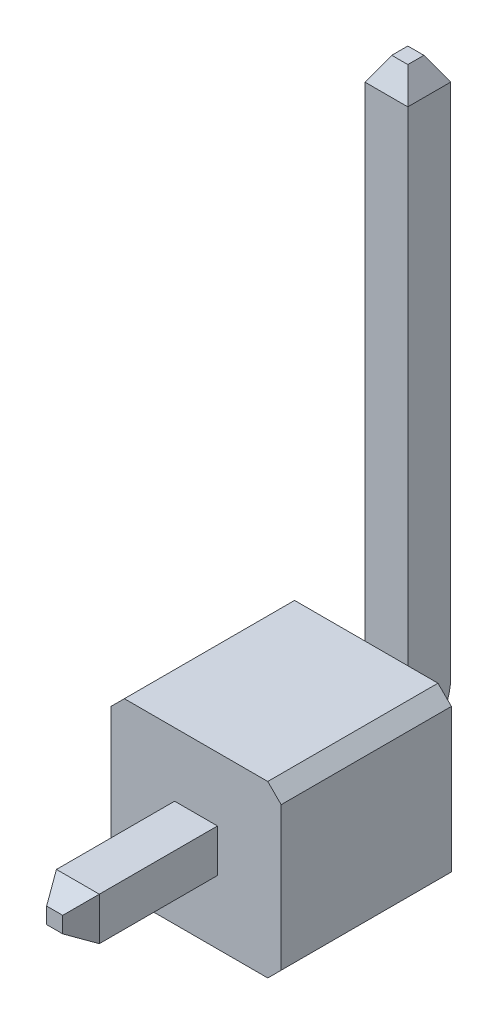
ISO-10303-21;
HEADER;
FILE_DESCRIPTION(('STEP AP214'),'2;1');
FILE_NAME('part.step','',(''),(''),'','','');
FILE_SCHEMA(('AUTOMOTIVE_DESIGN { 1 0 10303 214 1 1 1 1 }'));
ENDSEC;
DATA;
#1=APPLICATION_CONTEXT('core data for automotive mechanical design processes');
#2=APPLICATION_PROTOCOL_DEFINITION('international standard','automotive_design',2000,#1);
#3=PRODUCT_CONTEXT('',#1,'mechanical');
#4=PRODUCT('Part','Part','',(#3));
#5=PRODUCT_RELATED_PRODUCT_CATEGORY('part','',(#4));
#6=PRODUCT_DEFINITION_FORMATION('','',#4);
#7=PRODUCT_DEFINITION_CONTEXT('part definition',#1,'design');
#8=PRODUCT_DEFINITION('design','',#6,#7);
#9=PRODUCT_DEFINITION_SHAPE('','',#8);
#10=(LENGTH_UNIT() NAMED_UNIT(*) SI_UNIT(.MILLI.,.METRE.));
#11=(NAMED_UNIT(*) PLANE_ANGLE_UNIT() SI_UNIT($,.RADIAN.));
#12=(NAMED_UNIT(*) SI_UNIT($,.STERADIAN.) SOLID_ANGLE_UNIT());
#13=UNCERTAINTY_MEASURE_WITH_UNIT(LENGTH_MEASURE(1.E-05),#10,'distance_accuracy_value','');
#14=(GEOMETRIC_REPRESENTATION_CONTEXT(3) GLOBAL_UNCERTAINTY_ASSIGNED_CONTEXT((#13)) GLOBAL_UNIT_ASSIGNED_CONTEXT((#10,
#11,#12)) REPRESENTATION_CONTEXT('',''));
#15=CARTESIAN_POINT('',(0.,0.,0.));
#16=DIRECTION('',(0.,0.,1.));
#17=DIRECTION('',(1.,0.,0.));
#18=AXIS2_PLACEMENT_3D('',#15,#16,#17);
#19=CARTESIAN_POINT('',(-0.32,-8.22,0.499999999999999));
#20=DIRECTION('',(0.,-1.,0.));
#21=DIRECTION('',(0.,0.,-1.));
#22=AXIS2_PLACEMENT_3D('',#19,#20,#21);
#23=PLANE('',#22);
#24=DIRECTION('',(0.,0.,1.));
#25=VECTOR('',#24,1.);
#26=CARTESIAN_POINT('',(0.32,-8.22,0.499999999999999));
#27=LINE('',#26,#25);
#28=CARTESIAN_POINT('',(0.32,-8.22,3.16));
#29=VERTEX_POINT('',#28);
#30=CARTESIAN_POINT('',(0.32,-8.22,4.92358983848622));
#31=VERTEX_POINT('',#30);
#32=EDGE_CURVE('E228',#29,#31,#27,.T.);
#33=ORIENTED_EDGE('',*,*,#32,.F.);
#34=DIRECTION('',(-1.,0.,0.));
#35=VECTOR('',#34,1.);
#36=CARTESIAN_POINT('',(-0.32,-8.22,3.16));
#37=LINE('',#36,#35);
#38=CARTESIAN_POINT('',(-0.32,-8.22,3.16));
#39=VERTEX_POINT('',#38);
#40=EDGE_CURVE('E348',#29,#39,#37,.T.);
#41=ORIENTED_EDGE('',*,*,#40,.T.);
#42=DIRECTION('',(0.,0.,1.));
#43=VECTOR('',#42,1.);
#44=CARTESIAN_POINT('',(-0.32,-8.22,0.499999999999999));
#45=LINE('',#44,#43);
#46=CARTESIAN_POINT('',(-0.32,-8.22,4.92358983848622));
#47=VERTEX_POINT('',#46);
#48=EDGE_CURVE('E220',#39,#47,#45,.T.);
#49=ORIENTED_EDGE('',*,*,#48,.T.);
#50=DIRECTION('',(1.,0.,0.));
#51=VECTOR('',#50,1.);
#52=CARTESIAN_POINT('',(-0.32,-8.22,4.92358983848622));
#53=LINE('',#52,#51);
#54=EDGE_CURVE('E244',#47,#31,#53,.T.);
#55=ORIENTED_EDGE('',*,*,#54,.T.);
#56=EDGE_LOOP('',(#33,#41,#49,#55));
#57=FACE_BOUND('',#56,.T.);
#58=ADVANCED_FACE('F33',(#57),#23,.F.);
#59=CARTESIAN_POINT('',(-0.32,-8.86,0.499999999999999));
#60=DIRECTION('',(0.,1.,0.));
#61=DIRECTION('',(0.,0.,1.));
#62=AXIS2_PLACEMENT_3D('',#59,#60,#61);
#63=PLANE('',#62);
#64=DIRECTION('',(0.,0.,1.));
#65=VECTOR('',#64,1.);
#66=CARTESIAN_POINT('',(-0.32,-8.86,0.499999999999999));
#67=LINE('',#66,#65);
#68=CARTESIAN_POINT('',(-0.32,-8.86,3.16));
#69=VERTEX_POINT('',#68);
#70=CARTESIAN_POINT('',(-0.32,-8.86,4.92358983848622));
#71=VERTEX_POINT('',#70);
#72=EDGE_CURVE('E221',#69,#71,#67,.T.);
#73=ORIENTED_EDGE('',*,*,#72,.F.);
#74=DIRECTION('',(1.,0.,0.));
#75=VECTOR('',#74,1.);
#76=CARTESIAN_POINT('',(-0.32,-8.86,3.16));
#77=LINE('',#76,#75);
#78=CARTESIAN_POINT('',(0.32,-8.86,3.16));
#79=VERTEX_POINT('',#78);
#80=EDGE_CURVE('E346',#69,#79,#77,.T.);
#81=ORIENTED_EDGE('',*,*,#80,.T.);
#82=DIRECTION('',(0.,0.,1.));
#83=VECTOR('',#82,1.);
#84=CARTESIAN_POINT('',(0.32,-8.86,0.499999999999999));
#85=LINE('',#84,#83);
#86=CARTESIAN_POINT('',(0.32,-8.86,4.92358983848622));
#87=VERTEX_POINT('',#86);
#88=EDGE_CURVE('E383',#79,#87,#85,.T.);
#89=ORIENTED_EDGE('',*,*,#88,.T.);
#90=DIRECTION('',(-1.,0.,0.));
#91=VECTOR('',#90,1.);
#92=CARTESIAN_POINT('',(-0.32,-8.86,4.92358983848622));
#93=LINE('',#92,#91);
#94=EDGE_CURVE('E250',#87,#71,#93,.T.);
#95=ORIENTED_EDGE('',*,*,#94,.T.);
#96=EDGE_LOOP('',(#73,#81,#89,#95));
#97=FACE_BOUND('',#96,.T.);
#98=ADVANCED_FACE('F389',(#97),#63,.F.);
#99=CARTESIAN_POINT('',(0.32,-8.04,-0.320000000000001));
#100=DIRECTION('',(1.,0.,0.));
#101=DIRECTION('',(0.,0.,-1.));
#102=AXIS2_PLACEMENT_3D('',#99,#100,#101);
#103=PLANE('',#102);
#104=DIRECTION('',(0.,-1.,0.));
#105=VECTOR('',#104,1.);
#106=CARTESIAN_POINT('',(0.32,-8.04,3.16));
#107=LINE('',#106,#105);
#108=EDGE_CURVE('E286',#29,#79,#107,.T.);
#109=ORIENTED_EDGE('',*,*,#108,.F.);
#110=ORIENTED_EDGE('',*,*,#32,.T.);
#111=DIRECTION('',(0.,-1.,0.));
#112=VECTOR('',#111,1.);
#113=CARTESIAN_POINT('',(0.32,-8.86,4.92358983848622));
#114=LINE('',#113,#112);
#115=EDGE_CURVE('E247',#31,#87,#114,.T.);
#116=ORIENTED_EDGE('',*,*,#115,.T.);
#117=ORIENTED_EDGE('',*,*,#88,.F.);
#118=EDGE_LOOP('',(#109,#110,#116,#117));
#119=FACE_BOUND('',#118,.T.);
#120=ADVANCED_FACE('F396',(#119),#103,.T.);
#121=CARTESIAN_POINT('',(-0.32,-8.04,-0.320000000000001));
#122=DIRECTION('',(-1.,0.,0.));
#123=DIRECTION('',(0.,0.,1.));
#124=AXIS2_PLACEMENT_3D('',#121,#122,#123);
#125=PLANE('',#124);
#126=DIRECTION('',(0.,1.,0.));
#127=VECTOR('',#126,1.);
#128=CARTESIAN_POINT('',(-0.32,-8.04,3.16));
#129=LINE('',#128,#127);
#130=EDGE_CURVE('E204',#69,#39,#129,.T.);
#131=ORIENTED_EDGE('',*,*,#130,.F.);
#132=ORIENTED_EDGE('',*,*,#72,.T.);
#133=DIRECTION('',(0.,1.,0.));
#134=VECTOR('',#133,1.);
#135=CARTESIAN_POINT('',(-0.32,-8.22,4.92358983848622));
#136=LINE('',#135,#134);
#137=EDGE_CURVE('E232',#71,#47,#136,.T.);
#138=ORIENTED_EDGE('',*,*,#137,.T.);
#139=ORIENTED_EDGE('',*,*,#48,.F.);
#140=EDGE_LOOP('',(#131,#132,#138,#139));
#141=FACE_BOUND('',#140,.T.);
#142=ADVANCED_FACE('F412',(#141),#125,.T.);
#143=CARTESIAN_POINT('',(0.,-8.54,5.27));
#144=DIRECTION('',(0.,0.,-1.));
#145=DIRECTION('',(0.,1.,0.));
#146=AXIS2_PLACEMENT_3D('',#143,#144,#145);
#147=PLANE('',#146);
#148=DIRECTION('',(-1.,0.,0.));
#149=VECTOR('',#148,1.);
#150=CARTESIAN_POINT('',(0.,-8.42,5.27));
#151=LINE('',#150,#149);
#152=CARTESIAN_POINT('',(0.119999999999998,-8.42,5.27));
#153=VERTEX_POINT('',#152);
#154=CARTESIAN_POINT('',(-0.119999999999998,-8.42,5.27));
#155=VERTEX_POINT('',#154);
#156=EDGE_CURVE('E239',#153,#155,#151,.T.);
#157=ORIENTED_EDGE('',*,*,#156,.T.);
#158=DIRECTION('',(0.,-1.,0.));
#159=VECTOR('',#158,1.);
#160=CARTESIAN_POINT('',(-0.119999999999998,-8.86,5.27));
#161=LINE('',#160,#159);
#162=CARTESIAN_POINT('',(-0.119999999999998,-8.65999999999999,5.27));
#163=VERTEX_POINT('',#162);
#164=EDGE_CURVE('E241',#155,#163,#161,.T.);
#165=ORIENTED_EDGE('',*,*,#164,.T.);
#166=DIRECTION('',(1.,0.,0.));
#167=VECTOR('',#166,1.);
#168=CARTESIAN_POINT('',(0.,-8.65999999999999,5.27));
#169=LINE('',#168,#167);
#170=CARTESIAN_POINT('',(0.119999999999998,-8.65999999999999,5.27));
#171=VERTEX_POINT('',#170);
#172=EDGE_CURVE('E235',#163,#171,#169,.T.);
#173=ORIENTED_EDGE('',*,*,#172,.T.);
#174=DIRECTION('',(0.,1.,0.));
#175=VECTOR('',#174,1.);
#176=CARTESIAN_POINT('',(0.119999999999998,-8.22,5.27));
#177=LINE('',#176,#175);
#178=EDGE_CURVE('E237',#171,#153,#177,.T.);
#179=ORIENTED_EDGE('',*,*,#178,.T.);
#180=EDGE_LOOP('',(#157,#165,#173,#179));
#181=FACE_BOUND('',#180,.T.);
#182=ADVANCED_FACE('F421',(#181),#147,.F.);
#183=CARTESIAN_POINT('',(0.32,-8.04,4.92358983848622));
#184=DIRECTION('',(0.866025403784437,0.,0.500000000000003));
#185=DIRECTION('',(0.,1.,0.));
#186=AXIS2_PLACEMENT_3D('',#183,#184,#185);
#187=PLANE('',#186);
#188=DIRECTION('',(0.44721359549996,0.44721359549996,-0.774596669241481));
#189=VECTOR('',#188,1.);
#190=CARTESIAN_POINT('',(0.356,-8.184,4.86123600941374));
#191=LINE('',#190,#189);
#192=EDGE_CURVE('E260',#153,#31,#191,.T.);
#193=ORIENTED_EDGE('',*,*,#192,.F.);
#194=ORIENTED_EDGE('',*,*,#178,.F.);
#195=DIRECTION('',(0.44721359549996,-0.44721359549996,-0.774596669241481));
#196=VECTOR('',#195,1.);
#197=CARTESIAN_POINT('',(0.191999999999999,-8.732,5.14529234185504));
#198=LINE('',#197,#196);
#199=EDGE_CURVE('E263',#87,#171,#198,.F.);
#200=ORIENTED_EDGE('',*,*,#199,.F.);
#201=ORIENTED_EDGE('',*,*,#115,.F.);
#202=EDGE_LOOP('',(#193,#194,#200,#201));
#203=FACE_BOUND('',#202,.T.);
#204=ADVANCED_FACE('F401',(#203),#187,.T.);
#205=CARTESIAN_POINT('',(-0.32,-8.86,4.92358983848622));
#206=DIRECTION('',(0.,0.866025403784437,-0.500000000000003));
#207=DIRECTION('',(-1.,0.,0.));
#208=AXIS2_PLACEMENT_3D('',#205,#206,#207);
#209=PLANE('',#208);
#210=ORIENTED_EDGE('',*,*,#199,.T.);
#211=ORIENTED_EDGE('',*,*,#172,.F.);
#212=DIRECTION('',(0.44721359549996,0.44721359549996,0.774596669241481));
#213=VECTOR('',#212,1.);
#214=CARTESIAN_POINT('',(-0.32,-8.86,4.92358983848622));
#215=LINE('',#214,#213);
#216=EDGE_CURVE('E257',#71,#163,#215,.T.);
#217=ORIENTED_EDGE('',*,*,#216,.F.);
#218=ORIENTED_EDGE('',*,*,#94,.F.);
#219=EDGE_LOOP('',(#210,#211,#217,#218));
#220=FACE_BOUND('',#219,.T.);
#221=ADVANCED_FACE('F404',(#220),#209,.F.);
#222=CARTESIAN_POINT('',(-0.32,-8.22,4.92358983848622));
#223=DIRECTION('',(0.,-0.866025403784437,-0.500000000000003));
#224=DIRECTION('',(1.,0.,0.));
#225=AXIS2_PLACEMENT_3D('',#222,#223,#224);
#226=PLANE('',#225);
#227=ORIENTED_EDGE('',*,*,#192,.T.);
#228=ORIENTED_EDGE('',*,*,#54,.F.);
#229=DIRECTION('',(-0.44721359549996,0.44721359549996,-0.774596669241481));
#230=VECTOR('',#229,1.);
#231=CARTESIAN_POINT('',(-0.32,-8.22,4.92358983848622));
#232=LINE('',#231,#230);
#233=EDGE_CURVE('E254',#155,#47,#232,.T.);
#234=ORIENTED_EDGE('',*,*,#233,.F.);
#235=ORIENTED_EDGE('',*,*,#156,.F.);
#236=EDGE_LOOP('',(#227,#228,#234,#235));
#237=FACE_BOUND('',#236,.T.);
#238=ADVANCED_FACE('F418',(#237),#226,.F.);
#239=CARTESIAN_POINT('',(-0.32,-8.04,4.92358983848622));
#240=DIRECTION('',(-0.866025403784437,0.,0.500000000000003));
#241=DIRECTION('',(0.,-1.,0.));
#242=AXIS2_PLACEMENT_3D('',#239,#240,#241);
#243=PLANE('',#242);
#244=ORIENTED_EDGE('',*,*,#216,.T.);
#245=ORIENTED_EDGE('',*,*,#164,.F.);
#246=ORIENTED_EDGE('',*,*,#233,.T.);
#247=ORIENTED_EDGE('',*,*,#137,.F.);
#248=EDGE_LOOP('',(#244,#245,#246,#247));
#249=FACE_BOUND('',#248,.T.);
#250=ADVANCED_FACE('F408',(#249),#243,.T.);
#251=CARTESIAN_POINT('',(1.27,-7.27,3.16));
#252=DIRECTION('',(-1.,0.,0.));
#253=DIRECTION('',(0.,-1.,0.));
#254=AXIS2_PLACEMENT_3D('',#251,#252,#253);
#255=PLANE('',#254);
#256=DIRECTION('',(0.,1.,0.));
#257=VECTOR('',#256,1.);
#258=CARTESIAN_POINT('',(1.27,-7.27,0.62));
#259=LINE('',#258,#257);
#260=CARTESIAN_POINT('',(1.27,-9.61,0.62));
#261=VERTEX_POINT('',#260);
#262=CARTESIAN_POINT('',(1.27,-7.47,0.62));
#263=VERTEX_POINT('',#262);
#264=EDGE_CURVE('E513',#261,#263,#259,.T.);
#265=ORIENTED_EDGE('',*,*,#264,.T.);
#266=DIRECTION('',(0.,0.,1.));
#267=VECTOR('',#266,1.);
#268=CARTESIAN_POINT('',(1.27,-7.47,3.16));
#269=LINE('',#268,#267);
#270=CARTESIAN_POINT('',(1.27,-7.47,3.16));
#271=VERTEX_POINT('',#270);
#272=EDGE_CURVE('E323',#263,#271,#269,.T.);
#273=ORIENTED_EDGE('',*,*,#272,.T.);
#274=DIRECTION('',(0.,1.,0.));
#275=VECTOR('',#274,1.);
#276=CARTESIAN_POINT('',(1.27,-7.27,3.16));
#277=LINE('',#276,#275);
#278=CARTESIAN_POINT('',(1.27,-9.61,3.16));
#279=VERTEX_POINT('',#278);
#280=EDGE_CURVE('E333',#279,#271,#277,.T.);
#281=ORIENTED_EDGE('',*,*,#280,.F.);
#282=DIRECTION('',(0.,0.,-1.));
#283=VECTOR('',#282,1.);
#284=CARTESIAN_POINT('',(1.27,-9.61,3.16));
#285=LINE('',#284,#283);
#286=EDGE_CURVE('E320',#279,#261,#285,.T.);
#287=ORIENTED_EDGE('',*,*,#286,.T.);
#288=EDGE_LOOP('',(#265,#273,#281,#287));
#289=FACE_BOUND('',#288,.T.);
#290=ADVANCED_FACE('F511',(#289),#255,.F.);
#291=CARTESIAN_POINT('',(-1.27,-7.27,3.16));
#292=DIRECTION('',(0.,-1.,0.));
#293=DIRECTION('',(0.,0.,-1.));
#294=AXIS2_PLACEMENT_3D('',#291,#292,#293);
#295=PLANE('',#294);
#296=DIRECTION('',(-1.,0.,0.));
#297=VECTOR('',#296,1.);
#298=CARTESIAN_POINT('',(-1.27,-7.27,0.62));
#299=LINE('',#298,#297);
#300=CARTESIAN_POINT('',(1.07,-7.27,0.62));
#301=VERTEX_POINT('',#300);
#302=CARTESIAN_POINT('',(-1.07,-7.27,0.62));
#303=VERTEX_POINT('',#302);
#304=EDGE_CURVE('E339',#301,#303,#299,.T.);
#305=ORIENTED_EDGE('',*,*,#304,.T.);
#306=DIRECTION('',(0.,0.,1.));
#307=VECTOR('',#306,1.);
#308=CARTESIAN_POINT('',(-1.07,-7.27,3.16));
#309=LINE('',#308,#307);
#310=CARTESIAN_POINT('',(-1.07,-7.27,3.16));
#311=VERTEX_POINT('',#310);
#312=EDGE_CURVE('E311',#303,#311,#309,.T.);
#313=ORIENTED_EDGE('',*,*,#312,.T.);
#314=DIRECTION('',(-1.,0.,0.));
#315=VECTOR('',#314,1.);
#316=CARTESIAN_POINT('',(-1.27,-7.27,3.16));
#317=LINE('',#316,#315);
#318=CARTESIAN_POINT('',(1.07,-7.27,3.16));
#319=VERTEX_POINT('',#318);
#320=EDGE_CURVE('E337',#319,#311,#317,.T.);
#321=ORIENTED_EDGE('',*,*,#320,.F.);
#322=DIRECTION('',(0.,0.,-1.));
#323=VECTOR('',#322,1.);
#324=CARTESIAN_POINT('',(1.07,-7.27,3.16));
#325=LINE('',#324,#323);
#326=EDGE_CURVE('E308',#319,#301,#325,.T.);
#327=ORIENTED_EDGE('',*,*,#326,.T.);
#328=EDGE_LOOP('',(#305,#313,#321,#327));
#329=FACE_BOUND('',#328,.T.);
#330=ADVANCED_FACE('F519',(#329),#295,.F.);
#331=CARTESIAN_POINT('',(-1.27,-7.27,3.16));
#332=DIRECTION('',(1.,0.,0.));
#333=DIRECTION('',(0.,0.,-1.));
#334=AXIS2_PLACEMENT_3D('',#331,#332,#333);
#335=PLANE('',#334);
#336=DIRECTION('',(0.,-1.,0.));
#337=VECTOR('',#336,1.);
#338=CARTESIAN_POINT('',(-1.27,-7.27,3.16));
#339=LINE('',#338,#337);
#340=CARTESIAN_POINT('',(-1.27,-7.47,3.16));
#341=VERTEX_POINT('',#340);
#342=CARTESIAN_POINT('',(-1.27,-9.61,3.16));
#343=VERTEX_POINT('',#342);
#344=EDGE_CURVE('E522',#341,#343,#339,.T.);
#345=ORIENTED_EDGE('',*,*,#344,.F.);
#346=DIRECTION('',(0.,0.,-1.));
#347=VECTOR('',#346,1.);
#348=CARTESIAN_POINT('',(-1.27,-7.47,3.16));
#349=LINE('',#348,#347);
#350=CARTESIAN_POINT('',(-1.27,-7.47,0.62));
#351=VERTEX_POINT('',#350);
#352=EDGE_CURVE('E297',#341,#351,#349,.T.);
#353=ORIENTED_EDGE('',*,*,#352,.T.);
#354=DIRECTION('',(0.,-1.,0.));
#355=VECTOR('',#354,1.);
#356=CARTESIAN_POINT('',(-1.27,-7.27,0.62));
#357=LINE('',#356,#355);
#358=CARTESIAN_POINT('',(-1.27,-9.61,0.62));
#359=VERTEX_POINT('',#358);
#360=EDGE_CURVE('E334',#351,#359,#357,.T.);
#361=ORIENTED_EDGE('',*,*,#360,.T.);
#362=DIRECTION('',(0.,0.,1.));
#363=VECTOR('',#362,1.);
#364=CARTESIAN_POINT('',(-1.27,-9.61,3.16));
#365=LINE('',#364,#363);
#366=EDGE_CURVE('E295',#359,#343,#365,.T.);
#367=ORIENTED_EDGE('',*,*,#366,.T.);
#368=EDGE_LOOP('',(#345,#353,#361,#367));
#369=FACE_BOUND('',#368,.T.);
#370=ADVANCED_FACE('F530',(#369),#335,.F.);
#371=CARTESIAN_POINT('',(-1.27,-9.81,3.16));
#372=DIRECTION('',(0.,1.,0.));
#373=DIRECTION('',(0.,0.,1.));
#374=AXIS2_PLACEMENT_3D('',#371,#372,#373);
#375=PLANE('',#374);
#376=DIRECTION('',(1.,0.,0.));
#377=VECTOR('',#376,1.);
#378=CARTESIAN_POINT('',(-1.27,-9.81,0.62));
#379=LINE('',#378,#377);
#380=CARTESIAN_POINT('',(-1.07,-9.81,0.62));
#381=VERTEX_POINT('',#380);
#382=CARTESIAN_POINT('',(1.07,-9.81,0.62));
#383=VERTEX_POINT('',#382);
#384=EDGE_CURVE('E328',#381,#383,#379,.T.);
#385=ORIENTED_EDGE('',*,*,#384,.T.);
#386=DIRECTION('',(0.,0.,1.));
#387=VECTOR('',#386,1.);
#388=CARTESIAN_POINT('',(1.07,-9.81,3.16));
#389=LINE('',#388,#387);
#390=CARTESIAN_POINT('',(1.07,-9.81,3.16));
#391=VERTEX_POINT('',#390);
#392=EDGE_CURVE('E11',#383,#391,#389,.T.);
#393=ORIENTED_EDGE('',*,*,#392,.T.);
#394=DIRECTION('',(1.,0.,0.));
#395=VECTOR('',#394,1.);
#396=CARTESIAN_POINT('',(-1.27,-9.81,3.16));
#397=LINE('',#396,#395);
#398=CARTESIAN_POINT('',(-1.07,-9.81,3.16));
#399=VERTEX_POINT('',#398);
#400=EDGE_CURVE('E214',#399,#391,#397,.T.);
#401=ORIENTED_EDGE('',*,*,#400,.F.);
#402=DIRECTION('',(0.,0.,-1.));
#403=VECTOR('',#402,1.);
#404=CARTESIAN_POINT('',(-1.07,-9.81,3.16));
#405=LINE('',#404,#403);
#406=EDGE_CURVE('E41',#399,#381,#405,.T.);
#407=ORIENTED_EDGE('',*,*,#406,.T.);
#408=EDGE_LOOP('',(#385,#393,#401,#407));
#409=FACE_BOUND('',#408,.T.);
#410=ADVANCED_FACE('F327',(#409),#375,.F.);
#411=CARTESIAN_POINT('',(0.,0.,3.16));
#412=DIRECTION('',(0.,0.,1.));
#413=DIRECTION('',(1.,0.,0.));
#414=AXIS2_PLACEMENT_3D('',#411,#412,#413);
#415=PLANE('',#414);
#416=ORIENTED_EDGE('',*,*,#40,.F.);
#417=ORIENTED_EDGE('',*,*,#108,.T.);
#418=ORIENTED_EDGE('',*,*,#80,.F.);
#419=ORIENTED_EDGE('',*,*,#130,.T.);
#420=EDGE_LOOP('',(#416,#417,#418,#419));
#421=FACE_BOUND('',#420,.T.);
#422=ORIENTED_EDGE('',*,*,#320,.T.);
#423=DIRECTION('',(0.707106781186551,0.707106781186544,0.));
#424=VECTOR('',#423,1.);
#425=CARTESIAN_POINT('',(3.10000000000001,-3.10000000000003,3.16));
#426=LINE('',#425,#424);
#427=EDGE_CURVE('E318',#311,#341,#426,.F.);
#428=ORIENTED_EDGE('',*,*,#427,.T.);
#429=ORIENTED_EDGE('',*,*,#344,.T.);
#430=DIRECTION('',(-0.707106781186544,0.707106781186551,0.));
#431=VECTOR('',#430,1.);
#432=CARTESIAN_POINT('',(-5.44000000000001,-5.43999999999996,3.16));
#433=LINE('',#432,#431);
#434=EDGE_CURVE('E53',#343,#399,#433,.F.);
#435=ORIENTED_EDGE('',*,*,#434,.T.);
#436=ORIENTED_EDGE('',*,*,#400,.T.);
#437=DIRECTION('',(-0.707106781186544,-0.707106781186551,0.));
#438=VECTOR('',#437,1.);
#439=CARTESIAN_POINT('',(5.44,-5.43999999999996,3.16));
#440=LINE('',#439,#438);
#441=EDGE_CURVE('E314',#391,#279,#440,.F.);
#442=ORIENTED_EDGE('',*,*,#441,.T.);
#443=ORIENTED_EDGE('',*,*,#280,.T.);
#444=DIRECTION('',(0.707106781186541,-0.707106781186554,0.));
#445=VECTOR('',#444,1.);
#446=CARTESIAN_POINT('',(-3.09999999999999,-3.09999999999994,3.16));
#447=LINE('',#446,#445);
#448=EDGE_CURVE('E316',#271,#319,#447,.F.);
#449=ORIENTED_EDGE('',*,*,#448,.T.);
#450=EDGE_LOOP('',(#422,#428,#429,#435,#436,#442,#443,#449));
#451=FACE_BOUND('',#450,.T.);
#452=ADVANCED_FACE('F415',(#421,#451),#415,.T.);
#453=CARTESIAN_POINT('',(0.,0.,0.62));
#454=DIRECTION('',(0.,0.,1.));
#455=DIRECTION('',(1.,0.,0.));
#456=AXIS2_PLACEMENT_3D('',#453,#454,#455);
#457=PLANE('',#456);
#458=DIRECTION('',(0.,-1.,0.));
#459=VECTOR('',#458,1.);
#460=CARTESIAN_POINT('',(0.32,-8.04,0.62));
#461=LINE('',#460,#459);
#462=CARTESIAN_POINT('',(0.32,-8.22,0.62));
#463=VERTEX_POINT('',#462);
#464=CARTESIAN_POINT('',(0.32,-8.86,0.62));
#465=VERTEX_POINT('',#464);
#466=EDGE_CURVE('E344',#463,#465,#461,.T.);
#467=ORIENTED_EDGE('',*,*,#466,.F.);
#468=DIRECTION('',(-1.,0.,0.));
#469=VECTOR('',#468,1.);
#470=CARTESIAN_POINT('',(-0.32,-8.22,0.62));
#471=LINE('',#470,#469);
#472=CARTESIAN_POINT('',(-0.32,-8.22,0.62));
#473=VERTEX_POINT('',#472);
#474=EDGE_CURVE('E200',#463,#473,#471,.T.);
#475=ORIENTED_EDGE('',*,*,#474,.T.);
#476=DIRECTION('',(0.,1.,0.));
#477=VECTOR('',#476,1.);
#478=CARTESIAN_POINT('',(-0.32,-8.04,0.62));
#479=LINE('',#478,#477);
#480=CARTESIAN_POINT('',(-0.32,-8.86,0.62));
#481=VERTEX_POINT('',#480);
#482=EDGE_CURVE('E193',#481,#473,#479,.T.);
#483=ORIENTED_EDGE('',*,*,#482,.F.);
#484=DIRECTION('',(1.,0.,0.));
#485=VECTOR('',#484,1.);
#486=CARTESIAN_POINT('',(-0.32,-8.86,0.62));
#487=LINE('',#486,#485);
#488=EDGE_CURVE('E197',#481,#465,#487,.T.);
#489=ORIENTED_EDGE('',*,*,#488,.T.);
#490=EDGE_LOOP('',(#467,#475,#483,#489));
#491=FACE_BOUND('',#490,.T.);
#492=ORIENTED_EDGE('',*,*,#360,.F.);
#493=DIRECTION('',(-0.707106781186551,-0.707106781186544,0.));
#494=VECTOR('',#493,1.);
#495=CARTESIAN_POINT('',(-1.27,-7.47,0.62));
#496=LINE('',#495,#494);
#497=EDGE_CURVE('E306',#351,#303,#496,.F.);
#498=ORIENTED_EDGE('',*,*,#497,.T.);
#499=ORIENTED_EDGE('',*,*,#304,.F.);
#500=DIRECTION('',(-0.707106781186541,0.707106781186554,0.));
#501=VECTOR('',#500,1.);
#502=CARTESIAN_POINT('',(1.07,-7.27,0.62));
#503=LINE('',#502,#501);
#504=EDGE_CURVE('E304',#301,#263,#503,.F.);
#505=ORIENTED_EDGE('',*,*,#504,.T.);
#506=ORIENTED_EDGE('',*,*,#264,.F.);
#507=DIRECTION('',(0.707106781186544,0.707106781186551,0.));
#508=VECTOR('',#507,1.);
#509=CARTESIAN_POINT('',(1.27,-9.61,0.62));
#510=LINE('',#509,#508);
#511=EDGE_CURVE('E302',#261,#383,#510,.F.);
#512=ORIENTED_EDGE('',*,*,#511,.T.);
#513=ORIENTED_EDGE('',*,*,#384,.F.);
#514=DIRECTION('',(0.707106781186544,-0.707106781186551,0.));
#515=VECTOR('',#514,1.);
#516=CARTESIAN_POINT('',(-1.07,-9.81,0.62));
#517=LINE('',#516,#515);
#518=EDGE_CURVE('E300',#381,#359,#517,.F.);
#519=ORIENTED_EDGE('',*,*,#518,.T.);
#520=EDGE_LOOP('',(#492,#498,#499,#505,#506,#512,#513,#519));
#521=FACE_BOUND('',#520,.T.);
#522=ADVANCED_FACE('F195',(#491,#521),#457,.F.);
#523=CARTESIAN_POINT('',(0.,0.,0.));
#524=DIRECTION('',(0.,1.,0.));
#525=DIRECTION('',(0.,0.,1.));
#526=AXIS2_PLACEMENT_3D('',#523,#524,#525);
#527=PLANE('',#526);
#528=DIRECTION('',(1.,0.,0.));
#529=VECTOR('',#528,1.);
#530=CARTESIAN_POINT('',(0.,0.,0.119999999999998));
#531=LINE('',#530,#529);
#532=CARTESIAN_POINT('',(-0.119999999999998,0.,0.119999999999998));
#533=VERTEX_POINT('',#532);
#534=CARTESIAN_POINT('',(0.119999999999998,0.,0.119999999999998));
#535=VERTEX_POINT('',#534);
#536=EDGE_CURVE('E270',#533,#535,#531,.T.);
#537=ORIENTED_EDGE('',*,*,#536,.T.);
#538=DIRECTION('',(0.,0.,-1.));
#539=VECTOR('',#538,1.);
#540=CARTESIAN_POINT('',(0.119999999999998,0.,0.));
#541=LINE('',#540,#539);
#542=CARTESIAN_POINT('',(0.119999999999998,0.,-0.119999999999998));
#543=VERTEX_POINT('',#542);
#544=EDGE_CURVE('E272',#535,#543,#541,.T.);
#545=ORIENTED_EDGE('',*,*,#544,.T.);
#546=DIRECTION('',(-1.,0.,0.));
#547=VECTOR('',#546,1.);
#548=CARTESIAN_POINT('',(0.,0.,-0.119999999999998));
#549=LINE('',#548,#547);
#550=CARTESIAN_POINT('',(-0.119999999999998,0.,-0.119999999999998));
#551=VERTEX_POINT('',#550);
#552=EDGE_CURVE('E253',#543,#551,#549,.T.);
#553=ORIENTED_EDGE('',*,*,#552,.T.);
#554=DIRECTION('',(0.,0.,1.));
#555=VECTOR('',#554,1.);
#556=CARTESIAN_POINT('',(-0.119999999999998,0.,0.));
#557=LINE('',#556,#555);
#558=EDGE_CURVE('E268',#551,#533,#557,.T.);
#559=ORIENTED_EDGE('',*,*,#558,.T.);
#560=EDGE_LOOP('',(#537,#545,#553,#559));
#561=FACE_BOUND('',#560,.T.);
#562=ADVANCED_FACE('F472',(#561),#527,.T.);
#563=CARTESIAN_POINT('',(0.,0.,-0.119999999999998));
#564=DIRECTION('',(0.,-0.500000000000003,0.866025403784437));
#565=DIRECTION('',(-1.,0.,0.));
#566=AXIS2_PLACEMENT_3D('',#563,#564,#565);
#567=PLANE('',#566);
#568=DIRECTION('',(0.44721359549996,0.774596669241481,0.44721359549996));
#569=VECTOR('',#568,1.);
#570=CARTESIAN_POINT('',(-0.095999999999998,0.0415692193816524,-0.0959999999999978));
#571=LINE('',#570,#569);
#572=CARTESIAN_POINT('',(-0.32,-0.346410161513776,-0.32));
#573=VERTEX_POINT('',#572);
#574=EDGE_CURVE('E288',#573,#551,#571,.T.);
#575=ORIENTED_EDGE('',*,*,#574,.T.);
#576=ORIENTED_EDGE('',*,*,#552,.F.);
#577=DIRECTION('',(0.44721359549996,-0.774596669241481,-0.44721359549996));
#578=VECTOR('',#577,1.);
#579=CARTESIAN_POINT('',(0.0959999999999979,0.0415692193816523,-0.0959999999999978));
#580=LINE('',#579,#578);
#581=CARTESIAN_POINT('',(0.32,-0.346410161513776,-0.32));
#582=VERTEX_POINT('',#581);
#583=EDGE_CURVE('E283',#582,#543,#580,.F.);
#584=ORIENTED_EDGE('',*,*,#583,.F.);
#585=DIRECTION('',(1.,0.,0.));
#586=VECTOR('',#585,1.);
#587=CARTESIAN_POINT('',(-0.32,-0.346410161513776,-0.32));
#588=LINE('',#587,#586);
#589=EDGE_CURVE('E205',#573,#582,#588,.T.);
#590=ORIENTED_EDGE('',*,*,#589,.F.);
#591=EDGE_LOOP('',(#575,#576,#584,#590));
#592=FACE_BOUND('',#591,.T.);
#593=ADVANCED_FACE('F468',(#592),#567,.F.);
#594=CARTESIAN_POINT('',(0.,0.,0.119999999999998));
#595=DIRECTION('',(0.,-0.500000000000003,-0.866025403784437));
#596=DIRECTION('',(1.,0.,0.));
#597=AXIS2_PLACEMENT_3D('',#594,#595,#596);
#598=PLANE('',#597);
#599=DIRECTION('',(0.44721359549996,0.774596669241481,-0.44721359549996));
#600=VECTOR('',#599,1.);
#601=CARTESIAN_POINT('',(-0.095999999999998,0.0415692193816524,0.0959999999999981));
#602=LINE('',#601,#600);
#603=CARTESIAN_POINT('',(-0.32,-0.346410161513776,0.32));
#604=VERTEX_POINT('',#603);
#605=EDGE_CURVE('E258',#533,#604,#602,.F.);
#606=ORIENTED_EDGE('',*,*,#605,.T.);
#607=DIRECTION('',(-1.,0.,0.));
#608=VECTOR('',#607,1.);
#609=CARTESIAN_POINT('',(-0.32,-0.346410161513776,0.32));
#610=LINE('',#609,#608);
#611=CARTESIAN_POINT('',(0.32,-0.346410161513776,0.32));
#612=VERTEX_POINT('',#611);
#613=EDGE_CURVE('E278',#612,#604,#610,.T.);
#614=ORIENTED_EDGE('',*,*,#613,.F.);
#615=DIRECTION('',(-0.44721359549996,0.774596669241481,-0.44721359549996));
#616=VECTOR('',#615,1.);
#617=CARTESIAN_POINT('',(0.0959999999999979,0.0415692193816523,0.0959999999999981));
#618=LINE('',#617,#616);
#619=EDGE_CURVE('E285',#535,#612,#618,.F.);
#620=ORIENTED_EDGE('',*,*,#619,.F.);
#621=ORIENTED_EDGE('',*,*,#536,.F.);
#622=EDGE_LOOP('',(#606,#614,#620,#621));
#623=FACE_BOUND('',#622,.T.);
#624=ADVANCED_FACE('F476',(#623),#598,.F.);
#625=CARTESIAN_POINT('',(0.119999999999998,0.,0.));
#626=DIRECTION('',(-0.866025403784437,-0.500000000000003,0.));
#627=DIRECTION('',(0.,0.,-1.));
#628=AXIS2_PLACEMENT_3D('',#625,#626,#627);
#629=PLANE('',#628);
#630=ORIENTED_EDGE('',*,*,#619,.T.);
#631=DIRECTION('',(0.,0.,1.));
#632=VECTOR('',#631,1.);
#633=CARTESIAN_POINT('',(0.32,-0.346410161513776,-0.320000000000001));
#634=LINE('',#633,#632);
#635=EDGE_CURVE('E275',#582,#612,#634,.T.);
#636=ORIENTED_EDGE('',*,*,#635,.F.);
#637=ORIENTED_EDGE('',*,*,#583,.T.);
#638=ORIENTED_EDGE('',*,*,#544,.F.);
#639=EDGE_LOOP('',(#630,#636,#637,#638));
#640=FACE_BOUND('',#639,.T.);
#641=ADVANCED_FACE('F462',(#640),#629,.F.);
#642=CARTESIAN_POINT('',(0.,-8.04,0.499999999999999));
#643=DIRECTION('',(-1.,0.,0.));
#644=DIRECTION('',(0.,0.,1.));
#645=AXIS2_PLACEMENT_3D('',#642,#643,#644);
#646=CYLINDRICAL_SURFACE('',#645,0.82);
#647=DIRECTION('',(-1.,0.,0.));
#648=VECTOR('',#647,1.);
#649=CARTESIAN_POINT('',(-0.32,-8.04,-0.320000000000001));
#650=LINE('',#649,#648);
#651=CARTESIAN_POINT('',(0.32,-8.04,-0.320000000000001));
#652=VERTEX_POINT('',#651);
#653=CARTESIAN_POINT('',(-0.32,-8.04,-0.320000000000001));
#654=VERTEX_POINT('',#653);
#655=EDGE_CURVE('E266',#652,#654,#650,.T.);
#656=ORIENTED_EDGE('',*,*,#655,.F.);
#657=CARTESIAN_POINT('',(0.32,-8.04,0.499999999999999));
#658=DIRECTION('',(-1.,0.,0.));
#659=DIRECTION('',(0.,0.,1.));
#660=AXIS2_PLACEMENT_3D('',#657,#658,#659);
#661=CIRCLE('',#660,0.82);
#662=CARTESIAN_POINT('',(0.32,-8.86,0.499999999999999));
#663=VERTEX_POINT('',#662);
#664=EDGE_CURVE('E375',#652,#663,#661,.T.);
#665=ORIENTED_EDGE('',*,*,#664,.T.);
#666=DIRECTION('',(-1.,0.,0.));
#667=VECTOR('',#666,1.);
#668=CARTESIAN_POINT('',(-0.32,-8.86,0.499999999999999));
#669=LINE('',#668,#667);
#670=CARTESIAN_POINT('',(-0.32,-8.86,0.499999999999999));
#671=VERTEX_POINT('',#670);
#672=EDGE_CURVE('E362',#663,#671,#669,.T.);
#673=ORIENTED_EDGE('',*,*,#672,.T.);
#674=CARTESIAN_POINT('',(-0.32,-8.04,0.499999999999999));
#675=DIRECTION('',(-1.,0.,0.));
#676=DIRECTION('',(0.,0.,1.));
#677=AXIS2_PLACEMENT_3D('',#674,#675,#676);
#678=CIRCLE('',#677,0.82);
#679=EDGE_CURVE('E219',#654,#671,#678,.T.);
#680=ORIENTED_EDGE('',*,*,#679,.F.);
#681=EDGE_LOOP('',(#656,#665,#673,#680));
#682=FACE_BOUND('',#681,.T.);
#683=ADVANCED_FACE('F454',(#682),#646,.T.);
#684=CARTESIAN_POINT('',(-0.32,-8.04,-0.320000000000001));
#685=DIRECTION('',(0.,0.,-1.));
#686=DIRECTION('',(0.,1.,0.));
#687=AXIS2_PLACEMENT_3D('',#684,#685,#686);
#688=PLANE('',#687);
#689=DIRECTION('',(0.,1.,0.));
#690=VECTOR('',#689,1.);
#691=CARTESIAN_POINT('',(-0.32,-8.04,-0.320000000000001));
#692=LINE('',#691,#690);
#693=EDGE_CURVE('E366',#654,#573,#692,.T.);
#694=ORIENTED_EDGE('',*,*,#693,.T.);
#695=ORIENTED_EDGE('',*,*,#589,.T.);
#696=DIRECTION('',(0.,1.,0.));
#697=VECTOR('',#696,1.);
#698=CARTESIAN_POINT('',(0.32,-8.04,-0.320000000000001));
#699=LINE('',#698,#697);
#700=EDGE_CURVE('E358',#652,#582,#699,.T.);
#701=ORIENTED_EDGE('',*,*,#700,.F.);
#702=ORIENTED_EDGE('',*,*,#655,.T.);
#703=EDGE_LOOP('',(#694,#695,#701,#702));
#704=FACE_BOUND('',#703,.T.);
#705=ADVANCED_FACE('F457',(#704),#688,.T.);
#706=CARTESIAN_POINT('',(-0.119999999999998,0.,0.));
#707=DIRECTION('',(0.866025403784437,-0.500000000000003,0.));
#708=DIRECTION('',(0.,0.,1.));
#709=AXIS2_PLACEMENT_3D('',#706,#707,#708);
#710=PLANE('',#709);
#711=ORIENTED_EDGE('',*,*,#574,.F.);
#712=DIRECTION('',(0.,0.,-1.));
#713=VECTOR('',#712,1.);
#714=CARTESIAN_POINT('',(-0.32,-0.346410161513776,-0.320000000000001));
#715=LINE('',#714,#713);
#716=EDGE_CURVE('E280',#604,#573,#715,.T.);
#717=ORIENTED_EDGE('',*,*,#716,.F.);
#718=ORIENTED_EDGE('',*,*,#605,.F.);
#719=ORIENTED_EDGE('',*,*,#558,.F.);
#720=EDGE_LOOP('',(#711,#717,#718,#719));
#721=FACE_BOUND('',#720,.T.);
#722=ADVANCED_FACE('F483',(#721),#710,.F.);
#723=CARTESIAN_POINT('',(-0.32,-8.04,0.319999999999999));
#724=DIRECTION('',(0.,0.,1.));
#725=DIRECTION('',(0.,-1.,0.));
#726=AXIS2_PLACEMENT_3D('',#723,#724,#725);
#727=PLANE('',#726);
#728=DIRECTION('',(0.,1.,0.));
#729=VECTOR('',#728,1.);
#730=CARTESIAN_POINT('',(0.32,-8.04,0.319999999999999));
#731=LINE('',#730,#729);
#732=CARTESIAN_POINT('',(0.32,-8.04,0.319999999999999));
#733=VERTEX_POINT('',#732);
#734=EDGE_CURVE('E359',#733,#612,#731,.T.);
#735=ORIENTED_EDGE('',*,*,#734,.T.);
#736=ORIENTED_EDGE('',*,*,#613,.T.);
#737=DIRECTION('',(0.,1.,0.));
#738=VECTOR('',#737,1.);
#739=CARTESIAN_POINT('',(-0.32,-8.04,0.319999999999999));
#740=LINE('',#739,#738);
#741=CARTESIAN_POINT('',(-0.32,-8.04,0.319999999999999));
#742=VERTEX_POINT('',#741);
#743=EDGE_CURVE('E363',#742,#604,#740,.T.);
#744=ORIENTED_EDGE('',*,*,#743,.F.);
#745=DIRECTION('',(1.,0.,0.));
#746=VECTOR('',#745,1.);
#747=CARTESIAN_POINT('',(-0.32,-8.04,0.319999999999999));
#748=LINE('',#747,#746);
#749=EDGE_CURVE('E355',#742,#733,#748,.T.);
#750=ORIENTED_EDGE('',*,*,#749,.T.);
#751=EDGE_LOOP('',(#735,#736,#744,#750));
#752=FACE_BOUND('',#751,.T.);
#753=ADVANCED_FACE('F479',(#752),#727,.T.);
#754=CARTESIAN_POINT('',(0.,-8.04,0.499999999999999));
#755=DIRECTION('',(-1.,0.,0.));
#756=DIRECTION('',(0.,0.,1.));
#757=AXIS2_PLACEMENT_3D('',#754,#755,#756);
#758=CYLINDRICAL_SURFACE('',#757,0.18);
#759=ORIENTED_EDGE('',*,*,#749,.F.);
#760=CARTESIAN_POINT('',(-0.32,-8.04,0.499999999999999));
#761=DIRECTION('',(-1.,0.,0.));
#762=DIRECTION('',(0.,0.,1.));
#763=AXIS2_PLACEMENT_3D('',#760,#761,#762);
#764=CIRCLE('',#763,0.18);
#765=CARTESIAN_POINT('',(-0.32,-8.22,0.499999999999999));
#766=VERTEX_POINT('',#765);
#767=EDGE_CURVE('E379',#742,#766,#764,.T.);
#768=ORIENTED_EDGE('',*,*,#767,.T.);
#769=DIRECTION('',(1.,0.,0.));
#770=VECTOR('',#769,1.);
#771=CARTESIAN_POINT('',(-0.32,-8.22,0.499999999999999));
#772=LINE('',#771,#770);
#773=CARTESIAN_POINT('',(0.32,-8.22,0.499999999999999));
#774=VERTEX_POINT('',#773);
#775=EDGE_CURVE('E372',#766,#774,#772,.T.);
#776=ORIENTED_EDGE('',*,*,#775,.T.);
#777=CARTESIAN_POINT('',(0.32,-8.04,0.499999999999999));
#778=DIRECTION('',(-1.,0.,0.));
#779=DIRECTION('',(0.,0.,1.));
#780=AXIS2_PLACEMENT_3D('',#777,#778,#779);
#781=CIRCLE('',#780,0.18);
#782=EDGE_CURVE('E381',#733,#774,#781,.T.);
#783=ORIENTED_EDGE('',*,*,#782,.F.);
#784=EDGE_LOOP('',(#759,#768,#776,#783));
#785=FACE_BOUND('',#784,.T.);
#786=ADVANCED_FACE('F490',(#785),#758,.F.);
#787=EDGE_CURVE('E229',#774,#463,#27,.T.);
#788=ORIENTED_EDGE('',*,*,#787,.T.);
#789=ORIENTED_EDGE('',*,*,#466,.T.);
#790=EDGE_CURVE('E213',#663,#465,#85,.T.);
#791=ORIENTED_EDGE('',*,*,#790,.F.);
#792=ORIENTED_EDGE('',*,*,#664,.F.);
#793=ORIENTED_EDGE('',*,*,#700,.T.);
#794=ORIENTED_EDGE('',*,*,#635,.T.);
#795=ORIENTED_EDGE('',*,*,#734,.F.);
#796=ORIENTED_EDGE('',*,*,#782,.T.);
#797=EDGE_LOOP('',(#788,#789,#791,#792,#793,#794,#795,#796));
#798=FACE_BOUND('',#797,.T.);
#799=ADVANCED_FACE('F451',(#798),#103,.T.);
#800=EDGE_CURVE('E211',#671,#481,#67,.T.);
#801=ORIENTED_EDGE('',*,*,#800,.T.);
#802=ORIENTED_EDGE('',*,*,#482,.T.);
#803=EDGE_CURVE('E223',#766,#473,#45,.T.);
#804=ORIENTED_EDGE('',*,*,#803,.F.);
#805=ORIENTED_EDGE('',*,*,#767,.F.);
#806=ORIENTED_EDGE('',*,*,#743,.T.);
#807=ORIENTED_EDGE('',*,*,#716,.T.);
#808=ORIENTED_EDGE('',*,*,#693,.F.);
#809=ORIENTED_EDGE('',*,*,#679,.T.);
#810=EDGE_LOOP('',(#801,#802,#804,#805,#806,#807,#808,#809));
#811=FACE_BOUND('',#810,.T.);
#812=ADVANCED_FACE('F217',(#811),#125,.T.);
#813=ORIENTED_EDGE('',*,*,#488,.F.);
#814=ORIENTED_EDGE('',*,*,#800,.F.);
#815=ORIENTED_EDGE('',*,*,#672,.F.);
#816=ORIENTED_EDGE('',*,*,#790,.T.);
#817=EDGE_LOOP('',(#813,#814,#815,#816));
#818=FACE_BOUND('',#817,.T.);
#819=ADVANCED_FACE('F209',(#818),#63,.F.);
#820=ORIENTED_EDGE('',*,*,#474,.F.);
#821=ORIENTED_EDGE('',*,*,#787,.F.);
#822=ORIENTED_EDGE('',*,*,#775,.F.);
#823=ORIENTED_EDGE('',*,*,#803,.T.);
#824=EDGE_LOOP('',(#820,#821,#822,#823));
#825=FACE_BOUND('',#824,.T.);
#826=ADVANCED_FACE('F434',(#825),#23,.F.);
#827=CARTESIAN_POINT('',(-1.27,-7.47,3.16));
#828=DIRECTION('',(0.707106781186544,-0.707106781186551,0.));
#829=DIRECTION('',(0.,0.,-1.));
#830=AXIS2_PLACEMENT_3D('',#827,#828,#829);
#831=PLANE('',#830);
#832=ORIENTED_EDGE('',*,*,#427,.F.);
#833=ORIENTED_EDGE('',*,*,#312,.F.);
#834=ORIENTED_EDGE('',*,*,#497,.F.);
#835=ORIENTED_EDGE('',*,*,#352,.F.);
#836=EDGE_LOOP('',(#832,#833,#834,#835));
#837=FACE_BOUND('',#836,.T.);
#838=ADVANCED_FACE('F441',(#837),#831,.F.);
#839=CARTESIAN_POINT('',(1.07,-7.27,3.16));
#840=DIRECTION('',(-0.707106781186554,-0.707106781186541,0.));
#841=DIRECTION('',(0.,0.,-1.));
#842=AXIS2_PLACEMENT_3D('',#839,#840,#841);
#843=PLANE('',#842);
#844=ORIENTED_EDGE('',*,*,#448,.F.);
#845=ORIENTED_EDGE('',*,*,#272,.F.);
#846=ORIENTED_EDGE('',*,*,#504,.F.);
#847=ORIENTED_EDGE('',*,*,#326,.F.);
#848=EDGE_LOOP('',(#844,#845,#846,#847));
#849=FACE_BOUND('',#848,.T.);
#850=ADVANCED_FACE('F447',(#849),#843,.F.);
#851=CARTESIAN_POINT('',(1.27,-9.61,3.16));
#852=DIRECTION('',(-0.707106781186551,0.707106781186544,0.));
#853=DIRECTION('',(0.,0.,-1.));
#854=AXIS2_PLACEMENT_3D('',#851,#852,#853);
#855=PLANE('',#854);
#856=ORIENTED_EDGE('',*,*,#441,.F.);
#857=ORIENTED_EDGE('',*,*,#392,.F.);
#858=ORIENTED_EDGE('',*,*,#511,.F.);
#859=ORIENTED_EDGE('',*,*,#286,.F.);
#860=EDGE_LOOP('',(#856,#857,#858,#859));
#861=FACE_BOUND('',#860,.T.);
#862=ADVANCED_FACE('F497',(#861),#855,.F.);
#863=CARTESIAN_POINT('',(-1.07,-9.81,3.16));
#864=DIRECTION('',(0.707106781186551,0.707106781186544,0.));
#865=DIRECTION('',(0.,0.,-1.));
#866=AXIS2_PLACEMENT_3D('',#863,#864,#865);
#867=PLANE('',#866);
#868=ORIENTED_EDGE('',*,*,#434,.F.);
#869=ORIENTED_EDGE('',*,*,#366,.F.);
#870=ORIENTED_EDGE('',*,*,#518,.F.);
#871=ORIENTED_EDGE('',*,*,#406,.F.);
#872=EDGE_LOOP('',(#868,#869,#870,#871));
#873=FACE_BOUND('',#872,.T.);
#874=ADVANCED_FACE('F35',(#873),#867,.F.);
#875=CLOSED_SHELL('',(#58,#98,#120,#142,#182,#204,#221,#238,#250,#290,#330,#370,#410,#452,#522,
#562,#593,#624,#641,#683,#705,#722,#753,#786,#799,#812,#819,#826,#838,#850,#862,#874));
#876=MANIFOLD_SOLID_BREP('B2',#875);
#877=ADVANCED_BREP_SHAPE_REPRESENTATION('',(#18,#876),#14);
#878=SHAPE_DEFINITION_REPRESENTATION(#9,#877);
ENDSEC;
END-ISO-10303-21;
